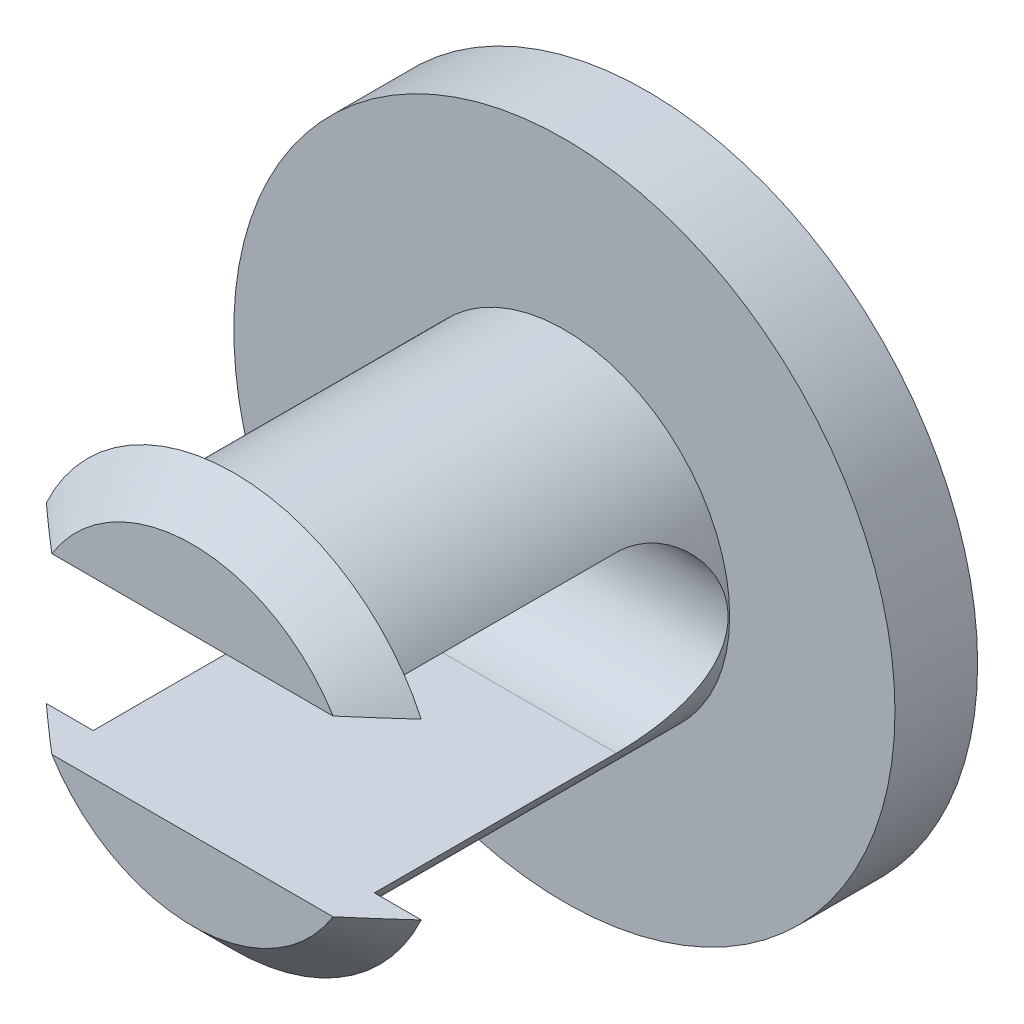
ISO-10303-21;
HEADER;
FILE_DESCRIPTION(('STEP AP214'),'2;1');
FILE_NAME('part.step','',(''),(''),'','','');
FILE_SCHEMA(('AUTOMOTIVE_DESIGN { 1 0 10303 214 1 1 1 1 }'));
ENDSEC;
DATA;
#1=APPLICATION_CONTEXT('core data for automotive mechanical design processes');
#2=APPLICATION_PROTOCOL_DEFINITION('international standard','automotive_design',2000,#1);
#3=PRODUCT_CONTEXT('',#1,'mechanical');
#4=PRODUCT('Part','Part','',(#3));
#5=PRODUCT_RELATED_PRODUCT_CATEGORY('part','',(#4));
#6=PRODUCT_DEFINITION_FORMATION('','',#4);
#7=PRODUCT_DEFINITION_CONTEXT('part definition',#1,'design');
#8=PRODUCT_DEFINITION('design','',#6,#7);
#9=PRODUCT_DEFINITION_SHAPE('','',#8);
#10=(LENGTH_UNIT() NAMED_UNIT(*) SI_UNIT(.MILLI.,.METRE.));
#11=(NAMED_UNIT(*) PLANE_ANGLE_UNIT() SI_UNIT($,.RADIAN.));
#12=(NAMED_UNIT(*) SI_UNIT($,.STERADIAN.) SOLID_ANGLE_UNIT());
#13=UNCERTAINTY_MEASURE_WITH_UNIT(LENGTH_MEASURE(1.E-05),#10,'distance_accuracy_value','');
#14=(GEOMETRIC_REPRESENTATION_CONTEXT(3) GLOBAL_UNCERTAINTY_ASSIGNED_CONTEXT((#13)) GLOBAL_UNIT_ASSIGNED_CONTEXT((#10,
#11,#12)) REPRESENTATION_CONTEXT('',''));
#15=CARTESIAN_POINT('',(0.,0.,0.));
#16=DIRECTION('',(0.,0.,1.));
#17=DIRECTION('',(1.,0.,0.));
#18=AXIS2_PLACEMENT_3D('',#15,#16,#17);
#19=CARTESIAN_POINT('',(0.,0.,10.));
#20=DIRECTION('',(0.,0.,1.));
#21=DIRECTION('',(1.,0.,0.));
#22=AXIS2_PLACEMENT_3D('',#19,#20,#21);
#23=PLANE('',#22);
#24=DIRECTION('',(-1.,0.,0.));
#25=VECTOR('',#24,1.);
#26=CARTESIAN_POINT('',(0.,-2.10362910934247,10.));
#27=LINE('',#26,#25);
#28=CARTESIAN_POINT('',(4.53593921589863,-2.10362910934247,10.));
#29=VERTEX_POINT('',#28);
#30=CARTESIAN_POINT('',(3.40216762819338,-2.10362910934247,10.));
#31=VERTEX_POINT('',#30);
#32=EDGE_CURVE('E123',#29,#31,#27,.T.);
#33=ORIENTED_EDGE('',*,*,#32,.F.);
#34=CARTESIAN_POINT('',(0.,0.,10.));
#35=DIRECTION('',(0.,0.,1.));
#36=DIRECTION('',(1.,0.,0.));
#37=AXIS2_PLACEMENT_3D('',#34,#35,#36);
#38=CIRCLE('',#37,5.);
#39=CARTESIAN_POINT('',(-4.53593921589863,-2.10362910934247,10.));
#40=VERTEX_POINT('',#39);
#41=EDGE_CURVE('E45',#40,#29,#38,.T.);
#42=ORIENTED_EDGE('',*,*,#41,.F.);
#43=CARTESIAN_POINT('',(-3.40216762819338,-2.10362910934247,10.));
#44=VERTEX_POINT('',#43);
#45=EDGE_CURVE('E186',#44,#40,#27,.T.);
#46=ORIENTED_EDGE('',*,*,#45,.F.);
#47=CARTESIAN_POINT('',(0.,0.,10.));
#48=DIRECTION('',(0.,0.,1.));
#49=DIRECTION('',(1.,0.,0.));
#50=AXIS2_PLACEMENT_3D('',#47,#48,#49);
#51=CIRCLE('',#50,4.);
#52=EDGE_CURVE('E227',#44,#31,#51,.T.);
#53=ORIENTED_EDGE('',*,*,#52,.T.);
#54=EDGE_LOOP('',(#33,#42,#46,#53));
#55=FACE_BOUND('',#54,.T.);
#56=ADVANCED_FACE('F41',(#55),#23,.F.);
#57=CARTESIAN_POINT('',(0.,0.,11.));
#58=DIRECTION('',(0.,0.,-1.));
#59=DIRECTION('',(-1.,0.,0.));
#60=AXIS2_PLACEMENT_3D('',#57,#58,#59);
#61=CONICAL_SURFACE('',#60,4.,0.785398163397449);
#62=ORIENTED_EDGE('',*,*,#41,.T.);
#63=CARTESIAN_POINT('',(4.53682104676027,-2.10362910934247,9.9992));
#64=CARTESIAN_POINT('',(4.40422482091585,-2.10362910934247,10.1194564169955));
#65=CARTESIAN_POINT('',(4.27119594537411,-2.10362910934247,10.2392434259916));
#66=CARTESIAN_POINT('',(4.00391573349462,-2.10362910934247,10.477519265963));
#67=CARTESIAN_POINT('',(3.86966406945259,-2.10362910934247,10.5960077289953));
#68=CARTESIAN_POINT('',(3.59850795391542,-2.10362910934247,10.8322587786945));
#69=CARTESIAN_POINT('',(3.46159065736887,-2.10362910934247,10.9500066637762));
#70=CARTESIAN_POINT('',(3.18574720377595,-2.10362910934247,11.1830929076919));
#71=CARTESIAN_POINT('',(3.04682134681864,-2.10362910934247,11.2984316203002));
#72=CARTESIAN_POINT('',(2.78371562035728,-2.10362910934247,11.5115699325693));
#73=CARTESIAN_POINT('',(2.65985644966245,-2.10362910934247,11.6097635756369));
#74=CARTESIAN_POINT('',(2.4093591852448,-2.10362910934247,11.8025229467449));
#75=CARTESIAN_POINT('',(2.28272144112657,-2.10362910934247,11.89708912713));
#76=CARTESIAN_POINT('',(2.0258714095937,-2.10362910934247,12.0808685117716));
#77=CARTESIAN_POINT('',(1.89566525846748,-2.10362910934247,12.1700901563591));
#78=CARTESIAN_POINT('',(1.69656720722016,-2.10362910934247,12.2979565992776));
#79=CARTESIAN_POINT('',(1.62958826549939,-2.10362910934247,12.3395740050021));
#80=CARTESIAN_POINT('',(1.49414963591913,-2.10362910934247,12.420315290291));
#81=CARTESIAN_POINT('',(1.42569015168811,-2.10362910934247,12.4594395098747));
#82=CARTESIAN_POINT('',(1.2901584268088,-2.10362910934247,12.532881600519));
#83=CARTESIAN_POINT('',(1.22316128132947,-2.10362910934247,12.5673362289647));
#84=CARTESIAN_POINT('',(1.08745477249298,-2.10362910934247,12.6326670770401));
#85=CARTESIAN_POINT('',(1.01874510285821,-2.10362910934247,12.66354265091));
#86=CARTESIAN_POINT('',(0.810034829400083,-2.10362910934247,12.7493536864105));
#87=CARTESIAN_POINT('',(0.667065449161171,-2.10362910934247,12.7976946204662));
#88=CARTESIAN_POINT('',(0.460612343909612,-2.10362910934247,12.8473329459006));
#89=CARTESIAN_POINT('',(0.399709717695514,-2.10362910934247,12.8595907044388));
#90=CARTESIAN_POINT('',(0.277112464293401,-2.10362910934247,12.8790585734233));
#91=CARTESIAN_POINT('',(0.21541823479286,-2.10362910934247,12.8862711246055));
#92=CARTESIAN_POINT('',(0.0917151570685554,-2.10362910934247,12.8952750571035));
#93=CARTESIAN_POINT('',(0.0297068435495331,-2.10362910934247,12.8970737161275));
#94=CARTESIAN_POINT('',(-0.0942269486328161,-2.10362910934247,12.8951733725608));
#95=CARTESIAN_POINT('',(-0.156152424367998,-2.10362910934247,12.8914741805173));
#96=CARTESIAN_POINT('',(-0.279196976955204,-2.10362910934247,12.8788035146313));
#97=CARTESIAN_POINT('',(-0.340318315814461,-2.10362910934247,12.8698536615519));
#98=CARTESIAN_POINT('',(-0.461661178124061,-2.10362910934247,12.8471342177842));
#99=CARTESIAN_POINT('',(-0.521882482941071,-2.10362910934247,12.8333634752432));
#100=CARTESIAN_POINT('',(-0.641324105018575,-2.10362910934247,12.8015395895381));
#101=CARTESIAN_POINT('',(-0.700541682263879,-2.10362910934247,12.7834762781083));
#102=CARTESIAN_POINT('',(-0.817719351122567,-2.10362910934247,12.7437015386589));
#103=CARTESIAN_POINT('',(-0.875679540256863,-2.10362910934247,12.7219903947096));
#104=CARTESIAN_POINT('',(-1.01687780404232,-2.10362910934247,12.6647458330494));
#105=CARTESIAN_POINT('',(-1.09940536663958,-2.10362910934247,12.6274645337664));
#106=CARTESIAN_POINT('',(-1.2620178846085,-2.10362910934247,12.5478757387486));
#107=CARTESIAN_POINT('',(-1.3421013842438,-2.10362910934247,12.5055653182572));
#108=CARTESIAN_POINT('',(-1.50028626207964,-2.10362910934247,12.4170151367679));
#109=CARTESIAN_POINT('',(-1.57838276571391,-2.10362910934247,12.3707667339968));
#110=CARTESIAN_POINT('',(-1.73271649870582,-2.10362910934247,12.2753188049795));
#111=CARTESIAN_POINT('',(-1.80895409261447,-2.10362910934247,12.2261198640186));
#112=CARTESIAN_POINT('',(-1.96064174860615,-2.10362910934247,12.1249090614109));
#113=CARTESIAN_POINT('',(-2.03607618935351,-2.10362910934247,12.0728738940543));
#114=CARTESIAN_POINT('',(-2.18562857549852,-2.10362910934247,11.9669404677976));
#115=CARTESIAN_POINT('',(-2.25974641747656,-2.10362910934247,11.9130420635103));
#116=CARTESIAN_POINT('',(-2.48025895043259,-2.10362910934247,11.7492766692656));
#117=CARTESIAN_POINT('',(-2.62501283306256,-2.10362910934247,11.6372029311959));
#118=CARTESIAN_POINT('',(-2.92238335866219,-2.10362910934247,11.4004276438586));
#119=CARTESIAN_POINT('',(-3.07475131642333,-2.10362910934247,11.2754169187079));
#120=CARTESIAN_POINT('',(-3.37696281520055,-2.10362910934247,11.0222693413911));
#121=CARTESIAN_POINT('',(-3.52680531547297,-2.10362910934247,10.8941312512326));
#122=CARTESIAN_POINT('',(-3.8207893129017,-2.10362910934247,10.6389823166368));
#123=CARTESIAN_POINT('',(-3.96497863826121,-2.10362910934247,10.5120263611236));
#124=CARTESIAN_POINT('',(-4.25188220498783,-2.10362910934247,10.2566235922687));
#125=CARTESIAN_POINT('',(-4.39459725493573,-2.10362910934247,10.1281776882584));
#126=CARTESIAN_POINT('',(-4.53682104676027,-2.10362910934247,9.9992));
#127=B_SPLINE_CURVE_WITH_KNOTS('',3,(#63,#64,#65,#66,#67,#68,#69,#70,#71,#72,#73,#74,#75,#76,
#77,#78,#79,#80,#81,#82,#83,#84,#85,#86,#87,#88,#89,#90,#91,#92,#93,#94,#95,#96,#97,#98,#99,
#100,#101,#102,#103,#104,#105,#106,#107,#108,#109,#110,#111,#112,#113,#114,#115,#116,#117,#118,
#119,#120,#121,#122,#123,#124,#125,#126),.UNSPECIFIED.,.F.,.F.,(4,2,2,2,2,2,2,2,2,2,2,2,2,2,2,2,
2,2,2,2,2,2,2,2,2,2,2,2,2,2,2,4),(0.,0.537026419519631,1.07420126337276,1.61593637526324,
2.15759136886255,2.63172338605043,3.10579608545412,3.57909921921861,3.81562343476288,
4.05211532394,4.27802021434388,4.50396580096424,4.95452477368102,5.14072621409494,
5.32683751283794,5.51269851660952,5.69856592519827,5.88367330258272,6.06882493779342,
6.25441961181858,6.43999983959518,6.71143375747181,6.98302631112199,7.25523103427655,
7.52738193885032,7.80226871698229,8.07717699299149,8.62626716915959,9.21747974904907,
9.80893028783708,10.3852647722141,10.9612643050185),.UNSPECIFIED.);
#128=CARTESIAN_POINT('',(3.40216762819338,-2.10362910934247,11.));
#129=VERTEX_POINT('',#128);
#130=EDGE_CURVE('E109',#29,#129,#127,.T.);
#131=ORIENTED_EDGE('',*,*,#130,.T.);
#132=CARTESIAN_POINT('',(0.,0.,11.));
#133=DIRECTION('',(0.,0.,1.));
#134=DIRECTION('',(1.,0.,0.));
#135=AXIS2_PLACEMENT_3D('',#132,#133,#134);
#136=CIRCLE('',#135,4.);
#137=CARTESIAN_POINT('',(-3.40216762819338,-2.10362910934247,11.));
#138=VERTEX_POINT('',#137);
#139=EDGE_CURVE('E120',#129,#138,#136,.F.);
#140=ORIENTED_EDGE('',*,*,#139,.T.);
#141=EDGE_CURVE('E59',#138,#40,#127,.T.);
#142=ORIENTED_EDGE('',*,*,#141,.T.);
#143=EDGE_LOOP('',(#62,#131,#140,#142));
#144=FACE_BOUND('',#143,.T.);
#145=ADVANCED_FACE('F119',(#144),#61,.T.);
#146=CARTESIAN_POINT('',(0.,0.,11.));
#147=DIRECTION('',(0.,0.,1.));
#148=DIRECTION('',(1.,0.,0.));
#149=AXIS2_PLACEMENT_3D('',#146,#147,#148);
#150=PLANE('',#149);
#151=CARTESIAN_POINT('',(-3.40216762819338,2.10362910934247,11.));
#152=VERTEX_POINT('',#151);
#153=CARTESIAN_POINT('',(3.40216762819338,2.10362910934247,11.));
#154=VERTEX_POINT('',#153);
#155=EDGE_CURVE('E128',#152,#154,#136,.F.);
#156=ORIENTED_EDGE('',*,*,#155,.F.);
#157=DIRECTION('',(-1.,0.,0.));
#158=VECTOR('',#157,1.);
#159=CARTESIAN_POINT('',(9.,2.10362910934247,11.));
#160=LINE('',#159,#158);
#161=EDGE_CURVE('E114',#152,#154,#160,.F.);
#162=ORIENTED_EDGE('',*,*,#161,.T.);
#163=EDGE_LOOP('',(#156,#162));
#164=FACE_BOUND('',#163,.T.);
#165=ADVANCED_FACE('F171',(#164),#150,.T.);
#166=ORIENTED_EDGE('',*,*,#139,.F.);
#167=DIRECTION('',(-1.,0.,0.));
#168=VECTOR('',#167,1.);
#169=CARTESIAN_POINT('',(0.,-2.10362910934247,11.));
#170=LINE('',#169,#168);
#171=EDGE_CURVE('E106',#129,#138,#170,.T.);
#172=ORIENTED_EDGE('',*,*,#171,.T.);
#173=EDGE_LOOP('',(#166,#172));
#174=FACE_BOUND('',#173,.T.);
#175=ADVANCED_FACE('F126',(#174),#150,.T.);
#176=CARTESIAN_POINT('',(0.,0.,11.));
#177=DIRECTION('',(0.,0.,-1.));
#178=DIRECTION('',(-1.,0.,0.));
#179=AXIS2_PLACEMENT_3D('',#176,#177,#178);
#180=CYLINDRICAL_SURFACE('',#179,4.);
#181=CARTESIAN_POINT('',(3.40216762819338,2.10362910934247,10.));
#182=VERTEX_POINT('',#181);
#183=CARTESIAN_POINT('',(-3.40216762819338,2.10362910934247,10.));
#184=VERTEX_POINT('',#183);
#185=EDGE_CURVE('E115',#182,#184,#51,.T.);
#186=ORIENTED_EDGE('',*,*,#185,.F.);
#187=DIRECTION('',(0.,0.,-1.));
#188=VECTOR('',#187,1.);
#189=CARTESIAN_POINT('',(3.40216762819338,2.10362910934247,11.));
#190=LINE('',#189,#188);
#191=CARTESIAN_POINT('',(3.40216762819338,2.10362910934247,4.14186042253959));
#192=VERTEX_POINT('',#191);
#193=EDGE_CURVE('E67',#182,#192,#190,.T.);
#194=ORIENTED_EDGE('',*,*,#193,.T.);
#195=CARTESIAN_POINT('',(3.40216762819338,-2.10362910934247,4.14186042253959));
#196=CARTESIAN_POINT('',(3.40214999714941,-2.10363949672896,4.08721970697073));
#197=CARTESIAN_POINT('',(3.40348351354995,-2.10150058850414,4.03258889804957));
#198=CARTESIAN_POINT('',(3.40871975973259,-2.0930061209405,3.92381680740212));
#199=CARTESIAN_POINT('',(3.41262071017473,-2.08665348187088,3.86967521295402));
#200=CARTESIAN_POINT('',(3.42282698553721,-2.0698660808456,3.76261111660125));
#201=CARTESIAN_POINT('',(3.42911708155529,-2.05945716373892,3.70968309942373));
#202=CARTESIAN_POINT('',(3.443864046315,-2.03470092092484,3.60507371255879));
#203=CARTESIAN_POINT('',(3.45232120375347,-2.02035307045288,3.55339250997702));
#204=CARTESIAN_POINT('',(3.48047947768841,-1.97171794261032,3.40097044536066));
#205=CARTESIAN_POINT('',(3.50300484854862,-1.93178131088696,3.30249115190142));
#206=CARTESIAN_POINT('',(3.55299801179498,-1.83820855620214,3.11355781204296));
#207=CARTESIAN_POINT('',(3.58047429739945,-1.78454882408513,3.02311796168034));
#208=CARTESIAN_POINT('',(3.64030325709938,-1.65934530221725,2.84384802615336));
#209=CARTESIAN_POINT('',(3.67287214138981,-1.58661777558965,2.75591479654246));
#210=CARTESIAN_POINT('',(3.73747230797148,-1.42781337182789,2.59280577921309));
#211=CARTESIAN_POINT('',(3.7695034303324,-1.34173259873438,2.51763372815991));
#212=CARTESIAN_POINT('',(3.83236001366754,-1.15060064527744,2.37648954619706));
#213=CARTESIAN_POINT('',(3.86290473502256,-1.04460099882987,2.31166470149727));
#214=CARTESIAN_POINT('',(3.91645584435806,-0.821289949485976,2.20118452980735));
#215=CARTESIAN_POINT('',(3.93946737857241,-0.70398634000194,2.15551611023995));
#216=CARTESIAN_POINT('',(3.97377947649298,-0.471008838651547,2.0883404620903));
#217=CARTESIAN_POINT('',(3.98584828040599,-0.355910870588598,2.06523744291415));
#218=CARTESIAN_POINT('',(3.99981070682649,-0.122890323764212,2.03855862219536));
#219=CARTESIAN_POINT('',(4.00171110306406,-0.0049696779530617,2.0349698211435));
#220=CARTESIAN_POINT('',(3.9954540138643,0.21820745615682,2.04688545270766));
#221=CARTESIAN_POINT('',(3.98824421336882,0.32359331485312,2.06059068834955));
#222=CARTESIAN_POINT('',(3.9660533115045,0.530310009078995,2.10343710597137));
#223=CARTESIAN_POINT('',(3.95107176378029,0.631640611342615,2.13257917453818));
#224=CARTESIAN_POINT('',(3.91445417056903,0.829011165277278,2.20557200104405));
#225=CARTESIAN_POINT('',(3.89273743256679,0.924969335029988,2.24960173504015));
#226=CARTESIAN_POINT('',(3.84455025039938,1.10834798485769,2.35082677803581));
#227=CARTESIAN_POINT('',(3.81807813457284,1.19576544587381,2.40802671876618));
#228=CARTESIAN_POINT('',(3.75963529473384,1.36906140626774,2.54060847481165));
#229=CARTESIAN_POINT('',(3.72737918311476,1.45388291381736,2.61724652726518));
#230=CARTESIAN_POINT('',(3.66262106150679,1.6100845162675,2.78322522477517));
#231=CARTESIAN_POINT('',(3.63011882676635,1.68145024169354,2.87257927265516));
#232=CARTESIAN_POINT('',(3.56580302960192,1.81408095376918,3.06969767621955));
#233=CARTESIAN_POINT('',(3.53423137771838,1.87415923901122,3.17834667092952));
#234=CARTESIAN_POINT('',(3.47908134744501,1.97466454000119,3.4060868011041));
#235=CARTESIAN_POINT('',(3.45548194268653,2.0151433725255,3.52514940910988));
#236=CARTESIAN_POINT('',(3.42634705366563,2.06413983394195,3.72786257009585));
#237=CARTESIAN_POINT('',(3.41738830358316,2.07886638488237,3.80955537498714));
#238=CARTESIAN_POINT('',(3.40525016753802,2.09864528718775,3.97474756199743));
#239=CARTESIAN_POINT('',(3.40208693232346,2.10367060556269,4.05825133849783));
#240=CARTESIAN_POINT('',(3.40216762819338,2.10362910934247,4.14186042253959));
#241=B_SPLINE_CURVE_WITH_KNOTS('',3,(#195,#196,#197,#198,#199,#200,#201,#202,#203,#204,#205,
#206,#207,#208,#209,#210,#211,#212,#213,#214,#215,#216,#217,#218,#219,#220,#221,#222,#223,#224,
#225,#226,#227,#228,#229,#230,#231,#232,#233,#234,#235,#236,#237,#238,#239,#240),.UNSPECIFIED.,
.F.,.F.,(4,2,2,2,2,2,2,2,2,2,2,2,2,2,2,2,2,2,2,2,2,2,4),(0.,0.163847847928127,0.327582261797181,
0.49029005310851,0.653019531700415,0.977392857198101,1.30232803173002,1.65685809272809,
2.01149178707207,2.39331602181974,2.77487886955417,3.12692431235646,3.47873520929455,
3.79678524095884,4.11485354123857,4.43689020786862,4.75904030260294,5.11389181717964,
5.469120158765,5.85146166028571,6.23278673684721,6.48252627546894,6.73296072746925),.UNSPECIFIED.);
#242=CARTESIAN_POINT('',(3.40216762819338,-2.10362910934247,4.14186042253959));
#243=VERTEX_POINT('',#242);
#244=EDGE_CURVE('E12',#243,#192,#241,.T.);
#245=ORIENTED_EDGE('',*,*,#244,.F.);
#246=DIRECTION('',(0.,0.,-1.));
#247=VECTOR('',#246,1.);
#248=CARTESIAN_POINT('',(3.40216762819338,-2.10362910934247,11.));
#249=LINE('',#248,#247);
#250=EDGE_CURVE('E229',#31,#243,#249,.T.);
#251=ORIENTED_EDGE('',*,*,#250,.F.);
#252=ORIENTED_EDGE('',*,*,#52,.F.);
#253=DIRECTION('',(0.,0.,-1.));
#254=VECTOR('',#253,1.);
#255=CARTESIAN_POINT('',(-3.40216762819338,-2.10362910934247,11.));
#256=LINE('',#255,#254);
#257=CARTESIAN_POINT('',(-3.40216762819338,-2.10362910934247,4.14186042253959));
#258=VERTEX_POINT('',#257);
#259=EDGE_CURVE('E124',#258,#44,#256,.F.);
#260=ORIENTED_EDGE('',*,*,#259,.F.);
#261=CARTESIAN_POINT('',(-3.40216762819338,2.10362910934247,4.14186042253959));
#262=CARTESIAN_POINT('',(-3.40214999714941,2.10363949672896,4.08721970697073));
#263=CARTESIAN_POINT('',(-3.40348351354995,2.10150058850414,4.03258889804957));
#264=CARTESIAN_POINT('',(-3.40871975973259,2.0930061209405,3.92381680740212));
#265=CARTESIAN_POINT('',(-3.41262071017473,2.08665348187088,3.86967521295402));
#266=CARTESIAN_POINT('',(-3.42282698553721,2.0698660808456,3.76261111660125));
#267=CARTESIAN_POINT('',(-3.42911708155529,2.05945716373892,3.70968309942373));
#268=CARTESIAN_POINT('',(-3.443864046315,2.03470092092484,3.60507371255879));
#269=CARTESIAN_POINT('',(-3.45232120375347,2.02035307045288,3.55339250997702));
#270=CARTESIAN_POINT('',(-3.48047947768841,1.97171794261032,3.40097044536066));
#271=CARTESIAN_POINT('',(-3.50300484854862,1.93178131088696,3.30249115190142));
#272=CARTESIAN_POINT('',(-3.55299801179498,1.83820855620214,3.11355781204296));
#273=CARTESIAN_POINT('',(-3.58047429739945,1.78454882408513,3.02311796168034));
#274=CARTESIAN_POINT('',(-3.64030325709938,1.65934530221725,2.84384802615336));
#275=CARTESIAN_POINT('',(-3.67287214138981,1.58661777558965,2.75591479654246));
#276=CARTESIAN_POINT('',(-3.73747230797148,1.42781337182789,2.59280577921309));
#277=CARTESIAN_POINT('',(-3.7695034303324,1.34173259873438,2.51763372815991));
#278=CARTESIAN_POINT('',(-3.83236001366754,1.15060064527744,2.37648954619706));
#279=CARTESIAN_POINT('',(-3.86290473502256,1.04460099882987,2.31166470149727));
#280=CARTESIAN_POINT('',(-3.91645584435806,0.821289949485976,2.20118452980735));
#281=CARTESIAN_POINT('',(-3.93946737857241,0.70398634000194,2.15551611023995));
#282=CARTESIAN_POINT('',(-3.97377947649298,0.471008838651547,2.0883404620903));
#283=CARTESIAN_POINT('',(-3.98584828040599,0.355910870588598,2.06523744291415));
#284=CARTESIAN_POINT('',(-3.99981070682649,0.122890323764212,2.03855862219536));
#285=CARTESIAN_POINT('',(-4.00171110306406,0.0049696779530617,2.0349698211435));
#286=CARTESIAN_POINT('',(-3.9954540138643,-0.21820745615682,2.04688545270766));
#287=CARTESIAN_POINT('',(-3.98824421336882,-0.32359331485312,2.06059068834955));
#288=CARTESIAN_POINT('',(-3.9660533115045,-0.530310009078995,2.10343710597137));
#289=CARTESIAN_POINT('',(-3.95107176378029,-0.631640611342615,2.13257917453818));
#290=CARTESIAN_POINT('',(-3.91445417056903,-0.829011165277278,2.20557200104405));
#291=CARTESIAN_POINT('',(-3.89273743256679,-0.924969335029988,2.24960173504015));
#292=CARTESIAN_POINT('',(-3.84455025039938,-1.10834798485769,2.35082677803581));
#293=CARTESIAN_POINT('',(-3.81807813457284,-1.19576544587381,2.40802671876618));
#294=CARTESIAN_POINT('',(-3.75963529473384,-1.36906140626774,2.54060847481165));
#295=CARTESIAN_POINT('',(-3.72737918311476,-1.45388291381736,2.61724652726518));
#296=CARTESIAN_POINT('',(-3.66262106150679,-1.6100845162675,2.78322522477517));
#297=CARTESIAN_POINT('',(-3.63011882676635,-1.68145024169354,2.87257927265516));
#298=CARTESIAN_POINT('',(-3.56580302960192,-1.81408095376918,3.06969767621955));
#299=CARTESIAN_POINT('',(-3.53423137771838,-1.87415923901122,3.17834667092952));
#300=CARTESIAN_POINT('',(-3.47908134744501,-1.97466454000119,3.4060868011041));
#301=CARTESIAN_POINT('',(-3.45548194268653,-2.0151433725255,3.52514940910988));
#302=CARTESIAN_POINT('',(-3.42634705366563,-2.06413983394195,3.72786257009585));
#303=CARTESIAN_POINT('',(-3.41738830358316,-2.07886638488237,3.80955537498714));
#304=CARTESIAN_POINT('',(-3.40525016753802,-2.09864528718775,3.97474756199743));
#305=CARTESIAN_POINT('',(-3.40208693232346,-2.10367060556269,4.05825133849783));
#306=CARTESIAN_POINT('',(-3.40216762819338,-2.10362910934247,4.14186042253959));
#307=B_SPLINE_CURVE_WITH_KNOTS('',3,(#261,#262,#263,#264,#265,#266,#267,#268,#269,#270,#271,
#272,#273,#274,#275,#276,#277,#278,#279,#280,#281,#282,#283,#284,#285,#286,#287,#288,#289,#290,
#291,#292,#293,#294,#295,#296,#297,#298,#299,#300,#301,#302,#303,#304,#305,#306),.UNSPECIFIED.,
.F.,.F.,(4,2,2,2,2,2,2,2,2,2,2,2,2,2,2,2,2,2,2,2,2,2,4),(0.,0.163847847928127,0.327582261797181,
0.49029005310851,0.653019531700415,0.977392857198101,1.30232803173002,1.65685809272809,
2.01149178707207,2.39331602181974,2.77487886955417,3.12692431235646,3.47873520929455,
3.79678524095884,4.11485354123857,4.43689020786862,4.75904030260294,5.11389181717964,
5.469120158765,5.85146166028571,6.23278673684721,6.48252627546894,6.73296072746925),.UNSPECIFIED.);
#308=CARTESIAN_POINT('',(-3.40216762819338,2.10362910934247,4.14186042253959));
#309=VERTEX_POINT('',#308);
#310=EDGE_CURVE('E51',#309,#258,#307,.T.);
#311=ORIENTED_EDGE('',*,*,#310,.F.);
#312=DIRECTION('',(0.,0.,-1.));
#313=VECTOR('',#312,1.);
#314=CARTESIAN_POINT('',(-3.40216762819338,2.10362910934247,11.));
#315=LINE('',#314,#313);
#316=EDGE_CURVE('E249',#309,#184,#315,.F.);
#317=ORIENTED_EDGE('',*,*,#316,.T.);
#318=EDGE_LOOP('',(#186,#194,#245,#251,#252,#260,#311,#317));
#319=FACE_BOUND('',#318,.T.);
#320=CARTESIAN_POINT('',(0.,0.,2.));
#321=DIRECTION('',(0.,0.,1.));
#322=DIRECTION('',(1.,0.,0.));
#323=AXIS2_PLACEMENT_3D('',#320,#321,#322);
#324=CIRCLE('',#323,4.);
#325=CARTESIAN_POINT('',(4.,0.,2.));
#326=VERTEX_POINT('',#325);
#327=EDGE_CURVE('E258',#326,#326,#324,.T.);
#328=ORIENTED_EDGE('',*,*,#327,.T.);
#329=EDGE_LOOP('',(#328));
#330=FACE_BOUND('',#329,.T.);
#331=ADVANCED_FACE('F205',(#319,#330),#180,.T.);
#332=CARTESIAN_POINT('',(0.,0.,2.));
#333=DIRECTION('',(0.,0.,-1.));
#334=DIRECTION('',(-1.,0.,0.));
#335=AXIS2_PLACEMENT_3D('',#332,#333,#334);
#336=CYLINDRICAL_SURFACE('',#335,8.);
#337=CARTESIAN_POINT('',(0.,0.,2.));
#338=DIRECTION('',(0.,0.,1.));
#339=DIRECTION('',(1.,0.,0.));
#340=AXIS2_PLACEMENT_3D('',#337,#338,#339);
#341=CIRCLE('',#340,8.);
#342=CARTESIAN_POINT('',(8.,0.,2.));
#343=VERTEX_POINT('',#342);
#344=EDGE_CURVE('E131',#343,#343,#341,.T.);
#345=ORIENTED_EDGE('',*,*,#344,.F.);
#346=EDGE_LOOP('',(#345));
#347=FACE_BOUND('',#346,.T.);
#348=CARTESIAN_POINT('',(0.,0.,0.));
#349=DIRECTION('',(0.,0.,1.));
#350=DIRECTION('',(1.,0.,0.));
#351=AXIS2_PLACEMENT_3D('',#348,#349,#350);
#352=CIRCLE('',#351,8.);
#353=CARTESIAN_POINT('',(8.,0.,0.));
#354=VERTEX_POINT('',#353);
#355=EDGE_CURVE('E127',#354,#354,#352,.T.);
#356=ORIENTED_EDGE('',*,*,#355,.T.);
#357=EDGE_LOOP('',(#356));
#358=FACE_BOUND('',#357,.T.);
#359=ADVANCED_FACE('F43',(#347,#358),#336,.T.);
#360=CARTESIAN_POINT('',(0.,0.,2.));
#361=DIRECTION('',(0.,0.,1.));
#362=DIRECTION('',(1.,0.,0.));
#363=AXIS2_PLACEMENT_3D('',#360,#361,#362);
#364=PLANE('',#363);
#365=ORIENTED_EDGE('',*,*,#327,.F.);
#366=EDGE_LOOP('',(#365));
#367=FACE_BOUND('',#366,.T.);
#368=ORIENTED_EDGE('',*,*,#344,.T.);
#369=EDGE_LOOP('',(#368));
#370=FACE_BOUND('',#369,.T.);
#371=ADVANCED_FACE('F210',(#367,#370),#364,.T.);
#372=CARTESIAN_POINT('',(0.,0.,0.));
#373=DIRECTION('',(0.,0.,1.));
#374=DIRECTION('',(1.,0.,0.));
#375=AXIS2_PLACEMENT_3D('',#372,#373,#374);
#376=PLANE('',#375);
#377=ORIENTED_EDGE('',*,*,#355,.F.);
#378=EDGE_LOOP('',(#377));
#379=FACE_BOUND('',#378,.T.);
#380=ADVANCED_FACE('F162',(#379),#376,.F.);
#381=CARTESIAN_POINT('',(4.53593921589863,2.10362910934247,10.));
#382=VERTEX_POINT('',#381);
#383=CARTESIAN_POINT('',(-4.53593921589863,2.10362910934247,10.));
#384=VERTEX_POINT('',#383);
#385=EDGE_CURVE('E134',#382,#384,#38,.T.);
#386=ORIENTED_EDGE('',*,*,#385,.F.);
#387=DIRECTION('',(-1.,0.,0.));
#388=VECTOR('',#387,1.);
#389=CARTESIAN_POINT('',(0.,2.10362910934247,10.));
#390=LINE('',#389,#388);
#391=EDGE_CURVE('E339',#382,#182,#390,.T.);
#392=ORIENTED_EDGE('',*,*,#391,.T.);
#393=ORIENTED_EDGE('',*,*,#185,.T.);
#394=EDGE_CURVE('E345',#184,#384,#390,.T.);
#395=ORIENTED_EDGE('',*,*,#394,.T.);
#396=EDGE_LOOP('',(#386,#392,#393,#395));
#397=FACE_BOUND('',#396,.T.);
#398=ADVANCED_FACE('F152',(#397),#23,.F.);
#399=CARTESIAN_POINT('',(4.53682104676027,2.10362910934247,9.9992));
#400=CARTESIAN_POINT('',(4.40422482091585,2.10362910934247,10.1194564169955));
#401=CARTESIAN_POINT('',(4.27119594537411,2.10362910934247,10.2392434259916));
#402=CARTESIAN_POINT('',(4.00391573349462,2.10362910934247,10.477519265963));
#403=CARTESIAN_POINT('',(3.86966406945259,2.10362910934247,10.5960077289953));
#404=CARTESIAN_POINT('',(3.59850795391542,2.10362910934247,10.8322587786945));
#405=CARTESIAN_POINT('',(3.46159065736887,2.10362910934247,10.9500066637762));
#406=CARTESIAN_POINT('',(3.18574720377595,2.10362910934247,11.1830929076919));
#407=CARTESIAN_POINT('',(3.04682134681864,2.10362910934247,11.2984316203002));
#408=CARTESIAN_POINT('',(2.78371562035728,2.10362910934247,11.5115699325693));
#409=CARTESIAN_POINT('',(2.65985644966245,2.10362910934247,11.6097635756369));
#410=CARTESIAN_POINT('',(2.4093591852448,2.10362910934247,11.8025229467449));
#411=CARTESIAN_POINT('',(2.28272144112657,2.10362910934247,11.89708912713));
#412=CARTESIAN_POINT('',(2.0258714095937,2.10362910934247,12.0808685117716));
#413=CARTESIAN_POINT('',(1.89566525846748,2.10362910934247,12.1700901563591));
#414=CARTESIAN_POINT('',(1.69656720722016,2.10362910934247,12.2979565992776));
#415=CARTESIAN_POINT('',(1.62958826549939,2.10362910934247,12.3395740050021));
#416=CARTESIAN_POINT('',(1.49414963591913,2.10362910934247,12.420315290291));
#417=CARTESIAN_POINT('',(1.42569015168811,2.10362910934247,12.4594395098747));
#418=CARTESIAN_POINT('',(1.2901584268088,2.10362910934247,12.532881600519));
#419=CARTESIAN_POINT('',(1.22316128132947,2.10362910934247,12.5673362289647));
#420=CARTESIAN_POINT('',(1.08745477249298,2.10362910934247,12.6326670770401));
#421=CARTESIAN_POINT('',(1.01874510285821,2.10362910934247,12.66354265091));
#422=CARTESIAN_POINT('',(0.810034829400083,2.10362910934247,12.7493536864105));
#423=CARTESIAN_POINT('',(0.667065449161171,2.10362910934247,12.7976946204662));
#424=CARTESIAN_POINT('',(0.460612343909612,2.10362910934247,12.8473329459006));
#425=CARTESIAN_POINT('',(0.399709717695514,2.10362910934247,12.8595907044388));
#426=CARTESIAN_POINT('',(0.277112464293401,2.10362910934247,12.8790585734233));
#427=CARTESIAN_POINT('',(0.21541823479286,2.10362910934247,12.8862711246055));
#428=CARTESIAN_POINT('',(0.0917151570685554,2.10362910934247,12.8952750571035));
#429=CARTESIAN_POINT('',(0.0297068435495331,2.10362910934247,12.8970737161275));
#430=CARTESIAN_POINT('',(-0.0942269486328161,2.10362910934247,12.8951733725608));
#431=CARTESIAN_POINT('',(-0.156152424367998,2.10362910934247,12.8914741805173));
#432=CARTESIAN_POINT('',(-0.279196976955204,2.10362910934247,12.8788035146313));
#433=CARTESIAN_POINT('',(-0.340318315814461,2.10362910934247,12.8698536615519));
#434=CARTESIAN_POINT('',(-0.461661178124061,2.10362910934247,12.8471342177842));
#435=CARTESIAN_POINT('',(-0.521882482941071,2.10362910934247,12.8333634752432));
#436=CARTESIAN_POINT('',(-0.641324105018575,2.10362910934247,12.8015395895381));
#437=CARTESIAN_POINT('',(-0.700541682263879,2.10362910934247,12.7834762781083));
#438=CARTESIAN_POINT('',(-0.817719351122567,2.10362910934247,12.7437015386589));
#439=CARTESIAN_POINT('',(-0.875679540256863,2.10362910934247,12.7219903947096));
#440=CARTESIAN_POINT('',(-1.01687780404232,2.10362910934247,12.6647458330494));
#441=CARTESIAN_POINT('',(-1.09940536663958,2.10362910934247,12.6274645337664));
#442=CARTESIAN_POINT('',(-1.2620178846085,2.10362910934247,12.5478757387486));
#443=CARTESIAN_POINT('',(-1.3421013842438,2.10362910934247,12.5055653182572));
#444=CARTESIAN_POINT('',(-1.50028626207964,2.10362910934247,12.4170151367679));
#445=CARTESIAN_POINT('',(-1.57838276571391,2.10362910934247,12.3707667339968));
#446=CARTESIAN_POINT('',(-1.73271649870582,2.10362910934247,12.2753188049795));
#447=CARTESIAN_POINT('',(-1.80895409261447,2.10362910934247,12.2261198640186));
#448=CARTESIAN_POINT('',(-1.96064174860615,2.10362910934247,12.1249090614109));
#449=CARTESIAN_POINT('',(-2.03607618935351,2.10362910934247,12.0728738940543));
#450=CARTESIAN_POINT('',(-2.18562857549852,2.10362910934247,11.9669404677976));
#451=CARTESIAN_POINT('',(-2.25974641747656,2.10362910934247,11.9130420635103));
#452=CARTESIAN_POINT('',(-2.48025895043259,2.10362910934247,11.7492766692656));
#453=CARTESIAN_POINT('',(-2.62501283306256,2.10362910934247,11.6372029311959));
#454=CARTESIAN_POINT('',(-2.92238335866219,2.10362910934247,11.4004276438586));
#455=CARTESIAN_POINT('',(-3.07475131642333,2.10362910934247,11.2754169187079));
#456=CARTESIAN_POINT('',(-3.37696281520055,2.10362910934247,11.0222693413911));
#457=CARTESIAN_POINT('',(-3.52680531547297,2.10362910934247,10.8941312512326));
#458=CARTESIAN_POINT('',(-3.8207893129017,2.10362910934247,10.6389823166368));
#459=CARTESIAN_POINT('',(-3.96497863826121,2.10362910934247,10.5120263611236));
#460=CARTESIAN_POINT('',(-4.25188220498783,2.10362910934247,10.2566235922687));
#461=CARTESIAN_POINT('',(-4.39459725493573,2.10362910934247,10.1281776882584));
#462=CARTESIAN_POINT('',(-4.53682104676027,2.10362910934247,9.9992));
#463=B_SPLINE_CURVE_WITH_KNOTS('',3,(#399,#400,#401,#402,#403,#404,#405,#406,#407,#408,#409,
#410,#411,#412,#413,#414,#415,#416,#417,#418,#419,#420,#421,#422,#423,#424,#425,#426,#427,#428,
#429,#430,#431,#432,#433,#434,#435,#436,#437,#438,#439,#440,#441,#442,#443,#444,#445,#446,#447,
#448,#449,#450,#451,#452,#453,#454,#455,#456,#457,#458,#459,#460,#461,#462),.UNSPECIFIED.,.F.,
.F.,(4,2,2,2,2,2,2,2,2,2,2,2,2,2,2,2,2,2,2,2,2,2,2,2,2,2,2,2,2,2,2,4),(0.,0.537026419519631,
1.07420126337276,1.61593637526324,2.15759136886255,2.63172338605043,3.10579608545412,
3.57909921921861,3.81562343476288,4.05211532394,4.27802021434388,4.50396580096424,
4.95452477368102,5.14072621409494,5.32683751283794,5.51269851660952,5.69856592519827,
5.88367330258272,6.06882493779342,6.25441961181858,6.43999983959518,6.71143375747181,
6.98302631112199,7.25523103427655,7.52738193885032,7.80226871698229,8.07717699299149,
8.62626716915959,9.21747974904907,9.80893028783708,10.3852647722141,10.9612643050185),.UNSPECIFIED.);
#464=EDGE_CURVE('E341',#382,#154,#463,.T.);
#465=ORIENTED_EDGE('',*,*,#464,.F.);
#466=ORIENTED_EDGE('',*,*,#385,.T.);
#467=EDGE_CURVE('E231',#152,#384,#463,.T.);
#468=ORIENTED_EDGE('',*,*,#467,.F.);
#469=ORIENTED_EDGE('',*,*,#155,.T.);
#470=EDGE_LOOP('',(#465,#466,#468,#469));
#471=FACE_BOUND('',#470,.T.);
#472=ADVANCED_FACE('F161',(#471),#61,.T.);
#473=CARTESIAN_POINT('',(9.,0.,4.14186042253959));
#474=DIRECTION('',(-1.,0.,0.));
#475=DIRECTION('',(0.,0.,1.));
#476=AXIS2_PLACEMENT_3D('',#473,#474,#475);
#477=CYLINDRICAL_SURFACE('',#476,2.10362910934247);
#478=ORIENTED_EDGE('',*,*,#244,.T.);
#479=DIRECTION('',(-1.,0.,0.));
#480=VECTOR('',#479,1.);
#481=CARTESIAN_POINT('',(9.,2.10362910934247,4.14186042253959));
#482=LINE('',#481,#480);
#483=EDGE_CURVE('E240',#192,#309,#482,.T.);
#484=ORIENTED_EDGE('',*,*,#483,.T.);
#485=ORIENTED_EDGE('',*,*,#310,.T.);
#486=DIRECTION('',(-1.,0.,0.));
#487=VECTOR('',#486,1.);
#488=CARTESIAN_POINT('',(9.,-2.10362910934247,4.14186042253959));
#489=LINE('',#488,#487);
#490=EDGE_CURVE('E239',#243,#258,#489,.T.);
#491=ORIENTED_EDGE('',*,*,#490,.F.);
#492=EDGE_LOOP('',(#478,#484,#485,#491));
#493=FACE_BOUND('',#492,.T.);
#494=ADVANCED_FACE('F169',(#493),#477,.F.);
#495=CARTESIAN_POINT('',(9.,2.10362910934247,11.));
#496=DIRECTION('',(0.,1.,0.));
#497=DIRECTION('',(0.,0.,1.));
#498=AXIS2_PLACEMENT_3D('',#495,#496,#497);
#499=PLANE('',#498);
#500=ORIENTED_EDGE('',*,*,#391,.F.);
#501=ORIENTED_EDGE('',*,*,#464,.T.);
#502=ORIENTED_EDGE('',*,*,#161,.F.);
#503=ORIENTED_EDGE('',*,*,#467,.T.);
#504=ORIENTED_EDGE('',*,*,#394,.F.);
#505=ORIENTED_EDGE('',*,*,#316,.F.);
#506=ORIENTED_EDGE('',*,*,#483,.F.);
#507=ORIENTED_EDGE('',*,*,#193,.F.);
#508=EDGE_LOOP('',(#500,#501,#502,#503,#504,#505,#506,#507));
#509=FACE_BOUND('',#508,.T.);
#510=ADVANCED_FACE('F163',(#509),#499,.F.);
#511=CARTESIAN_POINT('',(9.,-2.10362910934247,11.));
#512=DIRECTION('',(0.,1.,0.));
#513=DIRECTION('',(0.,0.,1.));
#514=AXIS2_PLACEMENT_3D('',#511,#512,#513);
#515=PLANE('',#514);
#516=ORIENTED_EDGE('',*,*,#250,.T.);
#517=ORIENTED_EDGE('',*,*,#490,.T.);
#518=ORIENTED_EDGE('',*,*,#259,.T.);
#519=ORIENTED_EDGE('',*,*,#45,.T.);
#520=ORIENTED_EDGE('',*,*,#141,.F.);
#521=ORIENTED_EDGE('',*,*,#171,.F.);
#522=ORIENTED_EDGE('',*,*,#130,.F.);
#523=ORIENTED_EDGE('',*,*,#32,.T.);
#524=EDGE_LOOP('',(#516,#517,#518,#519,#520,#521,#522,#523));
#525=FACE_BOUND('',#524,.T.);
#526=ADVANCED_FACE('F108',(#525),#515,.T.);
#527=CLOSED_SHELL('',(#56,#145,#165,#175,#331,#359,#371,#380,#398,#472,#494,#510,#526));
#528=MANIFOLD_SOLID_BREP('B2',#527);
#529=ADVANCED_BREP_SHAPE_REPRESENTATION('',(#18,#528),#14);
#530=SHAPE_DEFINITION_REPRESENTATION(#9,#529);
ENDSEC;
END-ISO-10303-21;
